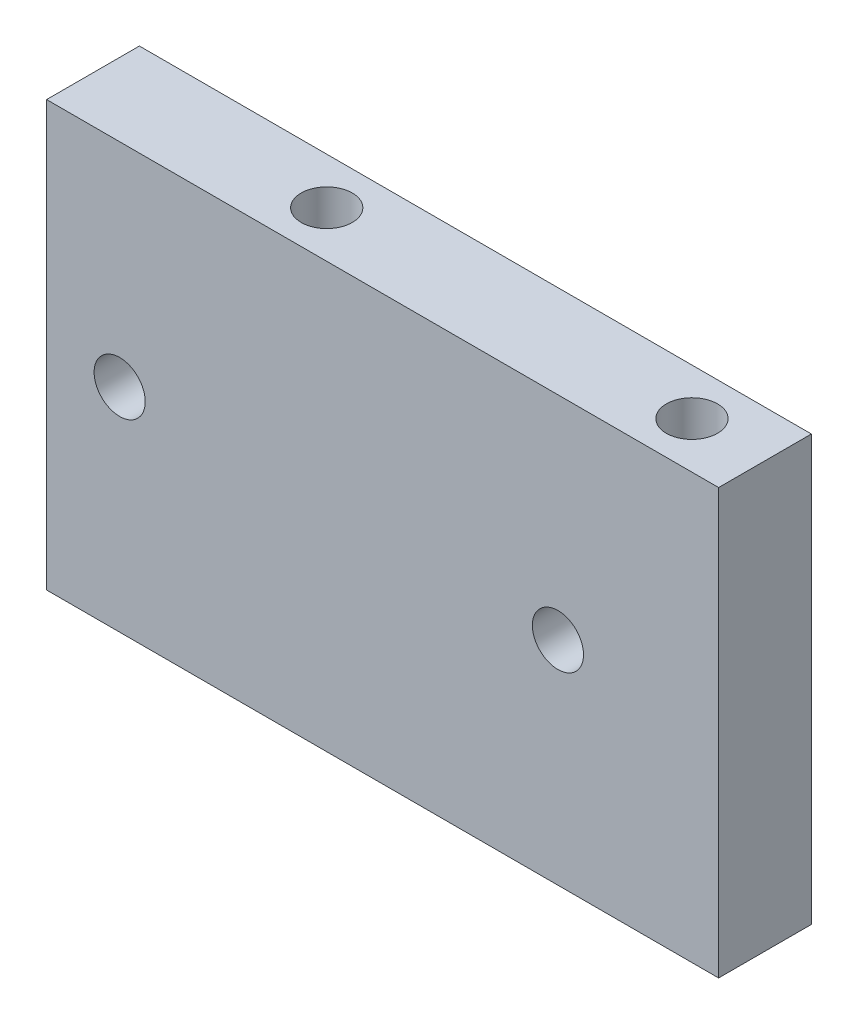
ISO-10303-21;
HEADER;
FILE_DESCRIPTION(('STEP AP214'),'2;1');
FILE_NAME('part.step','',(''),(''),'','','');
FILE_SCHEMA(('AUTOMOTIVE_DESIGN { 1 0 10303 214 1 1 1 1 }'));
ENDSEC;
DATA;
#1=APPLICATION_CONTEXT('core data for automotive mechanical design processes');
#2=APPLICATION_PROTOCOL_DEFINITION('international standard','automotive_design',2000,#1);
#3=PRODUCT_CONTEXT('',#1,'mechanical');
#4=PRODUCT('Part','Part','',(#3));
#5=PRODUCT_RELATED_PRODUCT_CATEGORY('part','',(#4));
#6=PRODUCT_DEFINITION_FORMATION('','',#4);
#7=PRODUCT_DEFINITION_CONTEXT('part definition',#1,'design');
#8=PRODUCT_DEFINITION('design','',#6,#7);
#9=PRODUCT_DEFINITION_SHAPE('','',#8);
#10=(LENGTH_UNIT() NAMED_UNIT(*) SI_UNIT(.MILLI.,.METRE.));
#11=(NAMED_UNIT(*) PLANE_ANGLE_UNIT() SI_UNIT($,.RADIAN.));
#12=(NAMED_UNIT(*) SI_UNIT($,.STERADIAN.) SOLID_ANGLE_UNIT());
#13=UNCERTAINTY_MEASURE_WITH_UNIT(LENGTH_MEASURE(1.E-05),#10,'distance_accuracy_value','');
#14=(GEOMETRIC_REPRESENTATION_CONTEXT(3) GLOBAL_UNCERTAINTY_ASSIGNED_CONTEXT((#13)) GLOBAL_UNIT_ASSIGNED_CONTEXT((#10,
#11,#12)) REPRESENTATION_CONTEXT('',''));
#15=CARTESIAN_POINT('',(0.,0.,0.));
#16=DIRECTION('',(0.,0.,1.));
#17=DIRECTION('',(1.,0.,0.));
#18=AXIS2_PLACEMENT_3D('',#15,#16,#17);
#19=CARTESIAN_POINT('',(23.,14.5375,6.35));
#20=DIRECTION('',(-1.,0.,0.));
#21=DIRECTION('',(0.,0.,1.));
#22=AXIS2_PLACEMENT_3D('',#19,#20,#21);
#23=PLANE('',#22);
#24=DIRECTION('',(0.,1.,0.));
#25=VECTOR('',#24,1.);
#26=CARTESIAN_POINT('',(23.,14.5375,0.));
#27=LINE('',#26,#25);
#28=CARTESIAN_POINT('',(23.,-14.5375,0.));
#29=VERTEX_POINT('',#28);
#30=CARTESIAN_POINT('',(23.,14.5375,0.));
#31=VERTEX_POINT('',#30);
#32=EDGE_CURVE('E128',#29,#31,#27,.T.);
#33=ORIENTED_EDGE('',*,*,#32,.T.);
#34=DIRECTION('',(0.,0.,-1.));
#35=VECTOR('',#34,1.);
#36=CARTESIAN_POINT('',(23.,14.5375,6.35));
#37=LINE('',#36,#35);
#38=CARTESIAN_POINT('',(23.,14.5375,6.35));
#39=VERTEX_POINT('',#38);
#40=EDGE_CURVE('E12',#39,#31,#37,.T.);
#41=ORIENTED_EDGE('',*,*,#40,.F.);
#42=DIRECTION('',(0.,1.,0.));
#43=VECTOR('',#42,1.);
#44=CARTESIAN_POINT('',(23.,14.5375,6.35));
#45=LINE('',#44,#43);
#46=CARTESIAN_POINT('',(23.,-14.5375,6.35));
#47=VERTEX_POINT('',#46);
#48=EDGE_CURVE('E89',#47,#39,#45,.T.);
#49=ORIENTED_EDGE('',*,*,#48,.F.);
#50=DIRECTION('',(0.,0.,-1.));
#51=VECTOR('',#50,1.);
#52=CARTESIAN_POINT('',(23.,-14.5375,6.35));
#53=LINE('',#52,#51);
#54=EDGE_CURVE('E100',#47,#29,#53,.T.);
#55=ORIENTED_EDGE('',*,*,#54,.T.);
#56=EDGE_LOOP('',(#33,#41,#49,#55));
#57=FACE_BOUND('',#56,.T.);
#58=ADVANCED_FACE('F38',(#57),#23,.F.);
#59=CARTESIAN_POINT('',(-23.,14.5375,6.35));
#60=DIRECTION('',(0.,-1.,0.));
#61=DIRECTION('',(0.,0.,-1.));
#62=AXIS2_PLACEMENT_3D('',#59,#60,#61);
#63=PLANE('',#62);
#64=CARTESIAN_POINT('',(18.,14.5375,3.175));
#65=DIRECTION('',(0.,1.,0.));
#66=DIRECTION('',(0.,0.,1.));
#67=AXIS2_PLACEMENT_3D('',#64,#65,#66);
#68=CIRCLE('',#67,1.75);
#69=CARTESIAN_POINT('',(18.,14.5375,4.925));
#70=VERTEX_POINT('',#69);
#71=EDGE_CURVE('E149',#70,#70,#68,.T.);
#72=ORIENTED_EDGE('',*,*,#71,.F.);
#73=EDGE_LOOP('',(#72));
#74=FACE_BOUND('',#73,.T.);
#75=CARTESIAN_POINT('',(-7.,14.5375,3.175));
#76=DIRECTION('',(0.,1.,0.));
#77=DIRECTION('',(0.,0.,1.));
#78=AXIS2_PLACEMENT_3D('',#75,#76,#77);
#79=CIRCLE('',#78,1.75);
#80=CARTESIAN_POINT('',(-7.,14.5375,4.925));
#81=VERTEX_POINT('',#80);
#82=EDGE_CURVE('E143',#81,#81,#79,.T.);
#83=ORIENTED_EDGE('',*,*,#82,.F.);
#84=EDGE_LOOP('',(#83));
#85=FACE_BOUND('',#84,.T.);
#86=DIRECTION('',(-1.,0.,0.));
#87=VECTOR('',#86,1.);
#88=CARTESIAN_POINT('',(-23.,14.5375,0.));
#89=LINE('',#88,#87);
#90=CARTESIAN_POINT('',(-23.,14.5375,0.));
#91=VERTEX_POINT('',#90);
#92=EDGE_CURVE('E94',#31,#91,#89,.T.);
#93=ORIENTED_EDGE('',*,*,#92,.T.);
#94=DIRECTION('',(0.,0.,-1.));
#95=VECTOR('',#94,1.);
#96=CARTESIAN_POINT('',(-23.,14.5375,6.35));
#97=LINE('',#96,#95);
#98=CARTESIAN_POINT('',(-23.,14.5375,6.35));
#99=VERTEX_POINT('',#98);
#100=EDGE_CURVE('E46',#99,#91,#97,.T.);
#101=ORIENTED_EDGE('',*,*,#100,.F.);
#102=DIRECTION('',(-1.,0.,0.));
#103=VECTOR('',#102,1.);
#104=CARTESIAN_POINT('',(-23.,14.5375,6.35));
#105=LINE('',#104,#103);
#106=EDGE_CURVE('E84',#39,#99,#105,.T.);
#107=ORIENTED_EDGE('',*,*,#106,.F.);
#108=ORIENTED_EDGE('',*,*,#40,.T.);
#109=EDGE_LOOP('',(#93,#101,#107,#108));
#110=FACE_BOUND('',#109,.T.);
#111=ADVANCED_FACE('F93',(#74,#85,#110),#63,.F.);
#112=CARTESIAN_POINT('',(-23.,14.5375,6.35));
#113=DIRECTION('',(1.,0.,0.));
#114=DIRECTION('',(0.,0.,-1.));
#115=AXIS2_PLACEMENT_3D('',#112,#113,#114);
#116=PLANE('',#115);
#117=DIRECTION('',(0.,-1.,0.));
#118=VECTOR('',#117,1.);
#119=CARTESIAN_POINT('',(-23.,14.5375,0.));
#120=LINE('',#119,#118);
#121=CARTESIAN_POINT('',(-23.,-14.5375,0.));
#122=VERTEX_POINT('',#121);
#123=EDGE_CURVE('E71',#91,#122,#120,.T.);
#124=ORIENTED_EDGE('',*,*,#123,.T.);
#125=DIRECTION('',(0.,0.,-1.));
#126=VECTOR('',#125,1.);
#127=CARTESIAN_POINT('',(-23.,-14.5375,6.35));
#128=LINE('',#127,#126);
#129=CARTESIAN_POINT('',(-23.,-14.5375,6.35));
#130=VERTEX_POINT('',#129);
#131=EDGE_CURVE('E95',#130,#122,#128,.T.);
#132=ORIENTED_EDGE('',*,*,#131,.F.);
#133=DIRECTION('',(0.,-1.,0.));
#134=VECTOR('',#133,1.);
#135=CARTESIAN_POINT('',(-23.,14.5375,6.35));
#136=LINE('',#135,#134);
#137=EDGE_CURVE('E87',#99,#130,#136,.T.);
#138=ORIENTED_EDGE('',*,*,#137,.F.);
#139=ORIENTED_EDGE('',*,*,#100,.T.);
#140=EDGE_LOOP('',(#124,#132,#138,#139));
#141=FACE_BOUND('',#140,.T.);
#142=ADVANCED_FACE('F96',(#141),#116,.F.);
#143=CARTESIAN_POINT('',(-23.,-14.5375,6.35));
#144=DIRECTION('',(0.,1.,0.));
#145=DIRECTION('',(0.,0.,1.));
#146=AXIS2_PLACEMENT_3D('',#143,#144,#145);
#147=PLANE('',#146);
#148=CARTESIAN_POINT('',(-7.,-14.5375,3.175));
#149=DIRECTION('',(0.,-1.,0.));
#150=DIRECTION('',(0.,0.,-1.));
#151=AXIS2_PLACEMENT_3D('',#148,#149,#150);
#152=CIRCLE('',#151,1.75);
#153=CARTESIAN_POINT('',(-7.,-14.5375,1.425));
#154=VERTEX_POINT('',#153);
#155=EDGE_CURVE('E138',#154,#154,#152,.T.);
#156=ORIENTED_EDGE('',*,*,#155,.F.);
#157=EDGE_LOOP('',(#156));
#158=FACE_BOUND('',#157,.T.);
#159=CARTESIAN_POINT('',(18.,-14.5375,3.175));
#160=DIRECTION('',(0.,-1.,0.));
#161=DIRECTION('',(0.,0.,-1.));
#162=AXIS2_PLACEMENT_3D('',#159,#160,#161);
#163=CIRCLE('',#162,1.75);
#164=CARTESIAN_POINT('',(18.,-14.5375,1.425));
#165=VERTEX_POINT('',#164);
#166=EDGE_CURVE('E131',#165,#165,#163,.T.);
#167=ORIENTED_EDGE('',*,*,#166,.F.);
#168=EDGE_LOOP('',(#167));
#169=FACE_BOUND('',#168,.T.);
#170=DIRECTION('',(1.,0.,0.));
#171=VECTOR('',#170,1.);
#172=CARTESIAN_POINT('',(-23.,-14.5375,0.));
#173=LINE('',#172,#171);
#174=EDGE_CURVE('E77',#122,#29,#173,.T.);
#175=ORIENTED_EDGE('',*,*,#174,.T.);
#176=ORIENTED_EDGE('',*,*,#54,.F.);
#177=DIRECTION('',(1.,0.,0.));
#178=VECTOR('',#177,1.);
#179=CARTESIAN_POINT('',(-23.,-14.5375,6.35));
#180=LINE('',#179,#178);
#181=EDGE_CURVE('E54',#130,#47,#180,.T.);
#182=ORIENTED_EDGE('',*,*,#181,.F.);
#183=ORIENTED_EDGE('',*,*,#131,.T.);
#184=EDGE_LOOP('',(#175,#176,#182,#183));
#185=FACE_BOUND('',#184,.T.);
#186=ADVANCED_FACE('F195',(#158,#169,#185),#147,.F.);
#187=CARTESIAN_POINT('',(0.,0.,6.35));
#188=DIRECTION('',(0.,0.,1.));
#189=DIRECTION('',(1.,0.,0.));
#190=AXIS2_PLACEMENT_3D('',#187,#188,#189);
#191=PLANE('',#190);
#192=CARTESIAN_POINT('',(-18.,0.,6.35));
#193=DIRECTION('',(0.,0.,1.));
#194=DIRECTION('',(1.,0.,0.));
#195=AXIS2_PLACEMENT_3D('',#192,#193,#194);
#196=CIRCLE('',#195,1.75);
#197=CARTESIAN_POINT('',(-16.25,0.,6.35));
#198=VERTEX_POINT('',#197);
#199=EDGE_CURVE('E123',#198,#198,#196,.T.);
#200=ORIENTED_EDGE('',*,*,#199,.F.);
#201=EDGE_LOOP('',(#200));
#202=FACE_BOUND('',#201,.T.);
#203=CARTESIAN_POINT('',(12.,0.,6.35));
#204=DIRECTION('',(0.,0.,1.));
#205=DIRECTION('',(1.,0.,0.));
#206=AXIS2_PLACEMENT_3D('',#203,#204,#205);
#207=CIRCLE('',#206,1.75);
#208=CARTESIAN_POINT('',(13.75,0.,6.35));
#209=VERTEX_POINT('',#208);
#210=EDGE_CURVE('E113',#209,#209,#207,.T.);
#211=ORIENTED_EDGE('',*,*,#210,.F.);
#212=EDGE_LOOP('',(#211));
#213=FACE_BOUND('',#212,.T.);
#214=ORIENTED_EDGE('',*,*,#48,.T.);
#215=ORIENTED_EDGE('',*,*,#106,.T.);
#216=ORIENTED_EDGE('',*,*,#137,.T.);
#217=ORIENTED_EDGE('',*,*,#181,.T.);
#218=EDGE_LOOP('',(#214,#215,#216,#217));
#219=FACE_BOUND('',#218,.T.);
#220=ADVANCED_FACE('F85',(#202,#213,#219),#191,.T.);
#221=CARTESIAN_POINT('',(0.,0.,0.));
#222=DIRECTION('',(0.,0.,1.));
#223=DIRECTION('',(1.,0.,0.));
#224=AXIS2_PLACEMENT_3D('',#221,#222,#223);
#225=PLANE('',#224);
#226=CARTESIAN_POINT('',(-18.,0.,0.));
#227=DIRECTION('',(0.,0.,1.));
#228=DIRECTION('',(1.,0.,0.));
#229=AXIS2_PLACEMENT_3D('',#226,#227,#228);
#230=CIRCLE('',#229,1.75);
#231=CARTESIAN_POINT('',(-16.25,0.,0.));
#232=VERTEX_POINT('',#231);
#233=EDGE_CURVE('E118',#232,#232,#230,.T.);
#234=ORIENTED_EDGE('',*,*,#233,.T.);
#235=EDGE_LOOP('',(#234));
#236=FACE_BOUND('',#235,.T.);
#237=CARTESIAN_POINT('',(12.,0.,0.));
#238=DIRECTION('',(0.,0.,1.));
#239=DIRECTION('',(1.,0.,0.));
#240=AXIS2_PLACEMENT_3D('',#237,#238,#239);
#241=CIRCLE('',#240,1.75);
#242=CARTESIAN_POINT('',(13.75,0.,0.));
#243=VERTEX_POINT('',#242);
#244=EDGE_CURVE('E119',#243,#243,#241,.T.);
#245=ORIENTED_EDGE('',*,*,#244,.T.);
#246=EDGE_LOOP('',(#245));
#247=FACE_BOUND('',#246,.T.);
#248=ORIENTED_EDGE('',*,*,#32,.F.);
#249=ORIENTED_EDGE('',*,*,#174,.F.);
#250=ORIENTED_EDGE('',*,*,#123,.F.);
#251=ORIENTED_EDGE('',*,*,#92,.F.);
#252=EDGE_LOOP('',(#248,#249,#250,#251));
#253=FACE_BOUND('',#252,.T.);
#254=ADVANCED_FACE('F196',(#236,#247,#253),#225,.F.);
#255=CARTESIAN_POINT('',(12.,0.,11.2997474683058));
#256=DIRECTION('',(0.,0.,-1.));
#257=DIRECTION('',(-1.,0.,0.));
#258=AXIS2_PLACEMENT_3D('',#255,#256,#257);
#259=CYLINDRICAL_SURFACE('',#258,1.75);
#260=ORIENTED_EDGE('',*,*,#244,.F.);
#261=EDGE_LOOP('',(#260));
#262=FACE_BOUND('',#261,.T.);
#263=ORIENTED_EDGE('',*,*,#210,.T.);
#264=EDGE_LOOP('',(#263));
#265=FACE_BOUND('',#264,.T.);
#266=ADVANCED_FACE('F198',(#262,#265),#259,.F.);
#267=CARTESIAN_POINT('',(-18.,0.,11.2997474683058));
#268=DIRECTION('',(0.,0.,-1.));
#269=DIRECTION('',(-1.,0.,0.));
#270=AXIS2_PLACEMENT_3D('',#267,#268,#269);
#271=CYLINDRICAL_SURFACE('',#270,1.75);
#272=ORIENTED_EDGE('',*,*,#233,.F.);
#273=EDGE_LOOP('',(#272));
#274=FACE_BOUND('',#273,.T.);
#275=ORIENTED_EDGE('',*,*,#199,.T.);
#276=EDGE_LOOP('',(#275));
#277=FACE_BOUND('',#276,.T.);
#278=ADVANCED_FACE('F205',(#274,#277),#271,.F.);
#279=CARTESIAN_POINT('',(18.,-6.5375,3.175));
#280=DIRECTION('',(0.,-1.,0.));
#281=DIRECTION('',(0.,0.,-1.));
#282=AXIS2_PLACEMENT_3D('',#279,#280,#281);
#283=CYLINDRICAL_SURFACE('',#282,1.75);
#284=CARTESIAN_POINT('',(18.,-6.5375,3.175));
#285=DIRECTION('',(0.,-1.,0.));
#286=DIRECTION('',(0.,0.,-1.));
#287=AXIS2_PLACEMENT_3D('',#284,#285,#286);
#288=CIRCLE('',#287,1.75);
#289=CARTESIAN_POINT('',(18.,-6.5375,1.425));
#290=VERTEX_POINT('',#289);
#291=EDGE_CURVE('E134',#290,#290,#288,.T.);
#292=ORIENTED_EDGE('',*,*,#291,.F.);
#293=EDGE_LOOP('',(#292));
#294=FACE_BOUND('',#293,.T.);
#295=ORIENTED_EDGE('',*,*,#166,.T.);
#296=EDGE_LOOP('',(#295));
#297=FACE_BOUND('',#296,.T.);
#298=ADVANCED_FACE('F247',(#294,#297),#283,.F.);
#299=CARTESIAN_POINT('',(18.,-6.5375,3.175));
#300=DIRECTION('',(0.,-1.,0.));
#301=DIRECTION('',(0.,0.,-1.));
#302=AXIS2_PLACEMENT_3D('',#299,#300,#301);
#303=PLANE('',#302);
#304=ORIENTED_EDGE('',*,*,#291,.T.);
#305=EDGE_LOOP('',(#304));
#306=FACE_BOUND('',#305,.T.);
#307=ADVANCED_FACE('F257',(#306),#303,.T.);
#308=CARTESIAN_POINT('',(-7.,-6.5375,3.175));
#309=DIRECTION('',(0.,-1.,0.));
#310=DIRECTION('',(0.,0.,-1.));
#311=AXIS2_PLACEMENT_3D('',#308,#309,#310);
#312=CYLINDRICAL_SURFACE('',#311,1.75);
#313=CARTESIAN_POINT('',(-7.,-6.5375,3.175));
#314=DIRECTION('',(0.,-1.,0.));
#315=DIRECTION('',(0.,0.,-1.));
#316=AXIS2_PLACEMENT_3D('',#313,#314,#315);
#317=CIRCLE('',#316,1.75);
#318=CARTESIAN_POINT('',(-7.,-6.5375,1.425));
#319=VERTEX_POINT('',#318);
#320=EDGE_CURVE('E122',#319,#319,#317,.T.);
#321=ORIENTED_EDGE('',*,*,#320,.F.);
#322=EDGE_LOOP('',(#321));
#323=FACE_BOUND('',#322,.T.);
#324=ORIENTED_EDGE('',*,*,#155,.T.);
#325=EDGE_LOOP('',(#324));
#326=FACE_BOUND('',#325,.T.);
#327=ADVANCED_FACE('F179',(#323,#326),#312,.F.);
#328=CARTESIAN_POINT('',(-7.,-6.5375,3.175));
#329=DIRECTION('',(0.,-1.,0.));
#330=DIRECTION('',(0.,0.,-1.));
#331=AXIS2_PLACEMENT_3D('',#328,#329,#330);
#332=PLANE('',#331);
#333=ORIENTED_EDGE('',*,*,#320,.T.);
#334=EDGE_LOOP('',(#333));
#335=FACE_BOUND('',#334,.T.);
#336=ADVANCED_FACE('F170',(#335),#332,.T.);
#337=CARTESIAN_POINT('',(-7.,6.5375,3.175));
#338=DIRECTION('',(0.,1.,0.));
#339=DIRECTION('',(0.,0.,1.));
#340=AXIS2_PLACEMENT_3D('',#337,#338,#339);
#341=CYLINDRICAL_SURFACE('',#340,1.75);
#342=CARTESIAN_POINT('',(-7.,6.5375,3.175));
#343=DIRECTION('',(0.,1.,0.));
#344=DIRECTION('',(0.,0.,1.));
#345=AXIS2_PLACEMENT_3D('',#342,#343,#344);
#346=CIRCLE('',#345,1.75);
#347=CARTESIAN_POINT('',(-7.,6.5375,4.925));
#348=VERTEX_POINT('',#347);
#349=EDGE_CURVE('E146',#348,#348,#346,.T.);
#350=ORIENTED_EDGE('',*,*,#349,.F.);
#351=EDGE_LOOP('',(#350));
#352=FACE_BOUND('',#351,.T.);
#353=ORIENTED_EDGE('',*,*,#82,.T.);
#354=EDGE_LOOP('',(#353));
#355=FACE_BOUND('',#354,.T.);
#356=ADVANCED_FACE('F168',(#352,#355),#341,.F.);
#357=CARTESIAN_POINT('',(-7.,6.5375,3.175));
#358=DIRECTION('',(0.,1.,0.));
#359=DIRECTION('',(0.,0.,1.));
#360=AXIS2_PLACEMENT_3D('',#357,#358,#359);
#361=PLANE('',#360);
#362=ORIENTED_EDGE('',*,*,#349,.T.);
#363=EDGE_LOOP('',(#362));
#364=FACE_BOUND('',#363,.T.);
#365=ADVANCED_FACE('F160',(#364),#361,.T.);
#366=CARTESIAN_POINT('',(18.,6.5375,3.175));
#367=DIRECTION('',(0.,1.,0.));
#368=DIRECTION('',(0.,0.,1.));
#369=AXIS2_PLACEMENT_3D('',#366,#367,#368);
#370=CYLINDRICAL_SURFACE('',#369,1.75);
#371=CARTESIAN_POINT('',(18.,6.5375,3.175));
#372=DIRECTION('',(0.,1.,0.));
#373=DIRECTION('',(0.,0.,1.));
#374=AXIS2_PLACEMENT_3D('',#371,#372,#373);
#375=CIRCLE('',#374,1.75);
#376=CARTESIAN_POINT('',(18.,6.5375,4.925));
#377=VERTEX_POINT('',#376);
#378=EDGE_CURVE('E135',#377,#377,#375,.T.);
#379=ORIENTED_EDGE('',*,*,#378,.F.);
#380=EDGE_LOOP('',(#379));
#381=FACE_BOUND('',#380,.T.);
#382=ORIENTED_EDGE('',*,*,#71,.T.);
#383=EDGE_LOOP('',(#382));
#384=FACE_BOUND('',#383,.T.);
#385=ADVANCED_FACE('F157',(#381,#384),#370,.F.);
#386=CARTESIAN_POINT('',(18.,6.5375,3.175));
#387=DIRECTION('',(0.,1.,0.));
#388=DIRECTION('',(0.,0.,1.));
#389=AXIS2_PLACEMENT_3D('',#386,#387,#388);
#390=PLANE('',#389);
#391=ORIENTED_EDGE('',*,*,#378,.T.);
#392=EDGE_LOOP('',(#391));
#393=FACE_BOUND('',#392,.T.);
#394=ADVANCED_FACE('F155',(#393),#390,.T.);
#395=CLOSED_SHELL('',(#58,#111,#142,#186,#220,#254,#266,#278,#298,#307,#327,#336,#356,#365,#385,#394));
#396=MANIFOLD_SOLID_BREP('B2',#395);
#397=ADVANCED_BREP_SHAPE_REPRESENTATION('',(#18,#396),#14);
#398=SHAPE_DEFINITION_REPRESENTATION(#9,#397);
ENDSEC;
END-ISO-10303-21;
